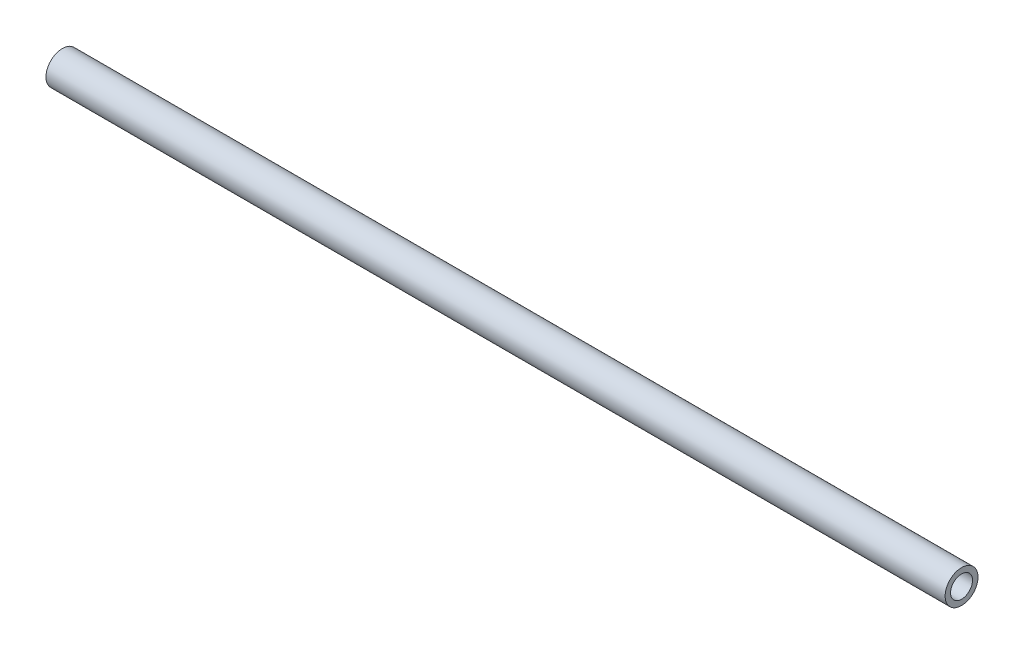
ISO-10303-21;
HEADER;
FILE_DESCRIPTION(('STEP AP214'),'2;1');
FILE_NAME('part.step','',(''),(''),'','','');
FILE_SCHEMA(('AUTOMOTIVE_DESIGN { 1 0 10303 214 1 1 1 1 }'));
ENDSEC;
DATA;
#1=APPLICATION_CONTEXT('core data for automotive mechanical design processes');
#2=APPLICATION_PROTOCOL_DEFINITION('international standard','automotive_design',2000,#1);
#3=PRODUCT_CONTEXT('',#1,'mechanical');
#4=PRODUCT('Part','Part','',(#3));
#5=PRODUCT_RELATED_PRODUCT_CATEGORY('part','',(#4));
#6=PRODUCT_DEFINITION_FORMATION('','',#4);
#7=PRODUCT_DEFINITION_CONTEXT('part definition',#1,'design');
#8=PRODUCT_DEFINITION('design','',#6,#7);
#9=PRODUCT_DEFINITION_SHAPE('','',#8);
#10=(LENGTH_UNIT() NAMED_UNIT(*) SI_UNIT(.MILLI.,.METRE.));
#11=(NAMED_UNIT(*) PLANE_ANGLE_UNIT() SI_UNIT($,.RADIAN.));
#12=(NAMED_UNIT(*) SI_UNIT($,.STERADIAN.) SOLID_ANGLE_UNIT());
#13=UNCERTAINTY_MEASURE_WITH_UNIT(LENGTH_MEASURE(1.E-05),#10,'distance_accuracy_value','');
#14=(GEOMETRIC_REPRESENTATION_CONTEXT(3) GLOBAL_UNCERTAINTY_ASSIGNED_CONTEXT((#13)) GLOBAL_UNIT_ASSIGNED_CONTEXT((#10,
#11,#12)) REPRESENTATION_CONTEXT('',''));
#15=CARTESIAN_POINT('',(0.,0.,0.));
#16=DIRECTION('',(0.,0.,1.));
#17=DIRECTION('',(1.,0.,0.));
#18=AXIS2_PLACEMENT_3D('',#15,#16,#17);
#19=CARTESIAN_POINT('',(82.,0.,0.));
#20=DIRECTION('',(1.,0.,0.));
#21=DIRECTION('',(0.,0.,-1.));
#22=AXIS2_PLACEMENT_3D('',#19,#20,#21);
#23=PLANE('',#22);
#24=CARTESIAN_POINT('',(82.,0.,0.));
#25=DIRECTION('',(1.,0.,0.));
#26=DIRECTION('',(0.,0.,-1.));
#27=AXIS2_PLACEMENT_3D('',#24,#25,#26);
#28=CIRCLE('',#27,3.);
#29=CARTESIAN_POINT('',(82.,0.,-3.));
#30=VERTEX_POINT('',#29);
#31=EDGE_CURVE('E11',#30,#30,#28,.T.);
#32=ORIENTED_EDGE('',*,*,#31,.T.);
#33=EDGE_LOOP('',(#32));
#34=FACE_BOUND('',#33,.T.);
#35=CARTESIAN_POINT('',(82.,0.,0.));
#36=DIRECTION('',(1.,0.,0.));
#37=DIRECTION('',(0.,0.,-1.));
#38=AXIS2_PLACEMENT_3D('',#35,#36,#37);
#39=CIRCLE('',#38,2.);
#40=CARTESIAN_POINT('',(82.,0.,-2.));
#41=VERTEX_POINT('',#40);
#42=EDGE_CURVE('E48',#41,#41,#39,.T.);
#43=ORIENTED_EDGE('',*,*,#42,.F.);
#44=EDGE_LOOP('',(#43));
#45=FACE_BOUND('',#44,.T.);
#46=ADVANCED_FACE('F37',(#34,#45),#23,.T.);
#47=CARTESIAN_POINT('',(-82.,0.,0.));
#48=DIRECTION('',(1.,0.,0.));
#49=DIRECTION('',(0.,0.,-1.));
#50=AXIS2_PLACEMENT_3D('',#47,#48,#49);
#51=PLANE('',#50);
#52=CARTESIAN_POINT('',(-82.,0.,0.));
#53=DIRECTION('',(1.,0.,0.));
#54=DIRECTION('',(0.,0.,-1.));
#55=AXIS2_PLACEMENT_3D('',#52,#53,#54);
#56=CIRCLE('',#55,3.);
#57=CARTESIAN_POINT('',(-82.,0.,-3.));
#58=VERTEX_POINT('',#57);
#59=EDGE_CURVE('E41',#58,#58,#56,.T.);
#60=ORIENTED_EDGE('',*,*,#59,.F.);
#61=EDGE_LOOP('',(#60));
#62=FACE_BOUND('',#61,.T.);
#63=CARTESIAN_POINT('',(-82.,0.,0.));
#64=DIRECTION('',(1.,0.,0.));
#65=DIRECTION('',(0.,0.,-1.));
#66=AXIS2_PLACEMENT_3D('',#63,#64,#65);
#67=CIRCLE('',#66,2.);
#68=CARTESIAN_POINT('',(-82.,0.,-2.));
#69=VERTEX_POINT('',#68);
#70=EDGE_CURVE('E50',#69,#69,#67,.T.);
#71=ORIENTED_EDGE('',*,*,#70,.T.);
#72=EDGE_LOOP('',(#71));
#73=FACE_BOUND('',#72,.T.);
#74=ADVANCED_FACE('F60',(#62,#73),#51,.F.);
#75=CARTESIAN_POINT('',(82.,0.,0.));
#76=DIRECTION('',(-1.,0.,0.));
#77=DIRECTION('',(0.,0.,1.));
#78=AXIS2_PLACEMENT_3D('',#75,#76,#77);
#79=CYLINDRICAL_SURFACE('',#78,3.);
#80=ORIENTED_EDGE('',*,*,#31,.F.);
#81=EDGE_LOOP('',(#80));
#82=FACE_BOUND('',#81,.T.);
#83=ORIENTED_EDGE('',*,*,#59,.T.);
#84=EDGE_LOOP('',(#83));
#85=FACE_BOUND('',#84,.T.);
#86=ADVANCED_FACE('F39',(#82,#85),#79,.T.);
#87=CARTESIAN_POINT('',(82.,0.,0.));
#88=DIRECTION('',(-1.,0.,0.));
#89=DIRECTION('',(0.,0.,1.));
#90=AXIS2_PLACEMENT_3D('',#87,#88,#89);
#91=CYLINDRICAL_SURFACE('',#90,2.);
#92=ORIENTED_EDGE('',*,*,#42,.T.);
#93=EDGE_LOOP('',(#92));
#94=FACE_BOUND('',#93,.T.);
#95=ORIENTED_EDGE('',*,*,#70,.F.);
#96=EDGE_LOOP('',(#95));
#97=FACE_BOUND('',#96,.T.);
#98=ADVANCED_FACE('F56',(#94,#97),#91,.F.);
#99=CLOSED_SHELL('',(#46,#74,#86,#98));
#100=MANIFOLD_SOLID_BREP('B2',#99);
#101=ADVANCED_BREP_SHAPE_REPRESENTATION('',(#18,#100),#14);
#102=SHAPE_DEFINITION_REPRESENTATION(#9,#101);
ENDSEC;
END-ISO-10303-21;
